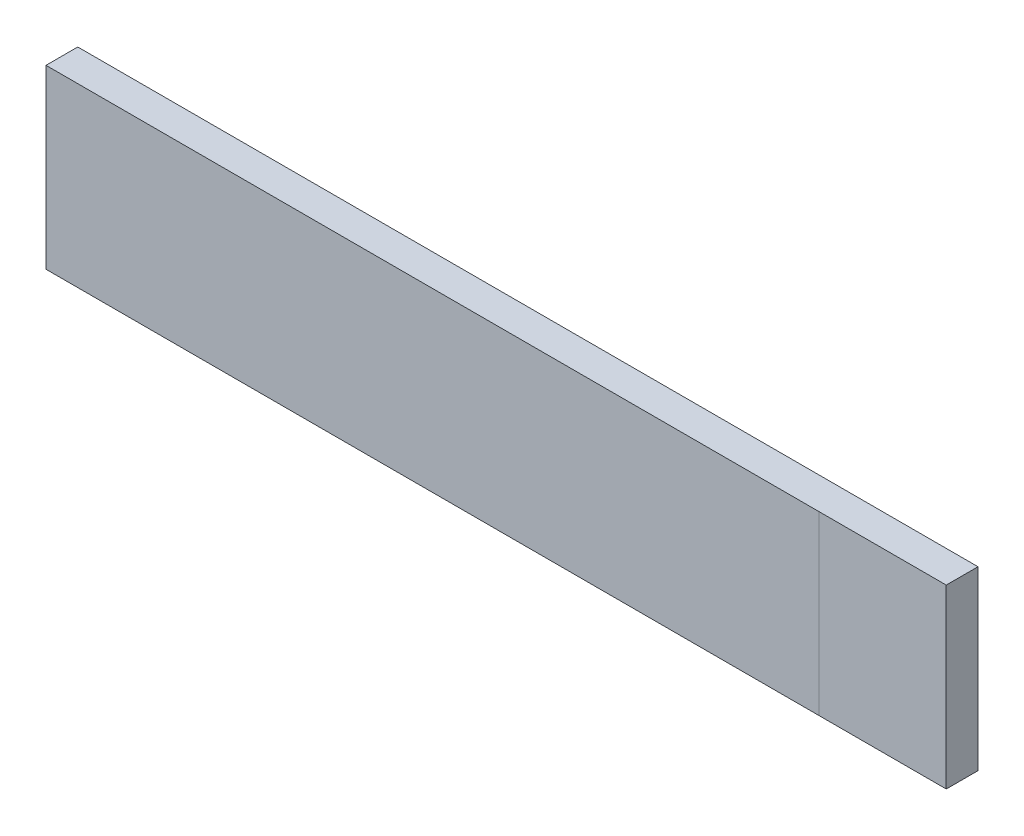
ISO-10303-21;
HEADER;
FILE_DESCRIPTION(('STEP AP214'),'2;1');
FILE_NAME('part.step','',(''),(''),'','','');
FILE_SCHEMA(('AUTOMOTIVE_DESIGN { 1 0 10303 214 1 1 1 1 }'));
ENDSEC;
DATA;
#1=APPLICATION_CONTEXT('core data for automotive mechanical design processes');
#2=APPLICATION_PROTOCOL_DEFINITION('international standard','automotive_design',2000,#1);
#3=PRODUCT_CONTEXT('',#1,'mechanical');
#4=PRODUCT('Part','Part','',(#3));
#5=PRODUCT_RELATED_PRODUCT_CATEGORY('part','',(#4));
#6=PRODUCT_DEFINITION_FORMATION('','',#4);
#7=PRODUCT_DEFINITION_CONTEXT('part definition',#1,'design');
#8=PRODUCT_DEFINITION('design','',#6,#7);
#9=PRODUCT_DEFINITION_SHAPE('','',#8);
#10=(LENGTH_UNIT() NAMED_UNIT(*) SI_UNIT(.MILLI.,.METRE.));
#11=(NAMED_UNIT(*) PLANE_ANGLE_UNIT() SI_UNIT($,.RADIAN.));
#12=(NAMED_UNIT(*) SI_UNIT($,.STERADIAN.) SOLID_ANGLE_UNIT());
#13=UNCERTAINTY_MEASURE_WITH_UNIT(LENGTH_MEASURE(1.E-05),#10,'distance_accuracy_value','');
#14=(GEOMETRIC_REPRESENTATION_CONTEXT(3) GLOBAL_UNCERTAINTY_ASSIGNED_CONTEXT((#13)) GLOBAL_UNIT_ASSIGNED_CONTEXT((#10,
#11,#12)) REPRESENTATION_CONTEXT('',''));
#15=CARTESIAN_POINT('',(0.,0.,0.));
#16=DIRECTION('',(0.,0.,1.));
#17=DIRECTION('',(1.,0.,0.));
#18=AXIS2_PLACEMENT_3D('',#15,#16,#17);
#19=CARTESIAN_POINT('',(0.,0.,10.));
#20=DIRECTION('',(0.,0.,-1.));
#21=DIRECTION('',(-1.,0.,0.));
#22=AXIS2_PLACEMENT_3D('',#19,#20,#21);
#23=PLANE('',#22);
#24=DIRECTION('',(0.,-1.,0.));
#25=VECTOR('',#24,1.);
#26=CARTESIAN_POINT('',(101.733337043281,0.,10.));
#27=LINE('',#26,#25);
#28=CARTESIAN_POINT('',(101.733337043281,27.8112231996147,10.));
#29=VERTEX_POINT('',#28);
#30=CARTESIAN_POINT('',(101.733337043281,-27.8112231996147,10.));
#31=VERTEX_POINT('',#30);
#32=EDGE_CURVE('E11',#29,#31,#27,.T.);
#33=ORIENTED_EDGE('',*,*,#32,.F.);
#34=DIRECTION('',(-1.,0.,0.));
#35=VECTOR('',#34,1.);
#36=CARTESIAN_POINT('',(-141.733337043281,27.8112231996147,10.));
#37=LINE('',#36,#35);
#38=CARTESIAN_POINT('',(-141.733337043281,27.8112231996147,10.));
#39=VERTEX_POINT('',#38);
#40=EDGE_CURVE('E98',#29,#39,#37,.T.);
#41=ORIENTED_EDGE('',*,*,#40,.T.);
#42=DIRECTION('',(0.,-1.,0.));
#43=VECTOR('',#42,1.);
#44=CARTESIAN_POINT('',(-141.733337043281,-27.8112231996147,10.));
#45=LINE('',#44,#43);
#46=CARTESIAN_POINT('',(-141.733337043281,-27.8112231996147,10.));
#47=VERTEX_POINT('',#46);
#48=EDGE_CURVE('E97',#39,#47,#45,.T.);
#49=ORIENTED_EDGE('',*,*,#48,.T.);
#50=DIRECTION('',(1.,0.,0.));
#51=VECTOR('',#50,1.);
#52=CARTESIAN_POINT('',(-141.733337043281,-27.8112231996147,10.));
#53=LINE('',#52,#51);
#54=EDGE_CURVE('E87',#47,#31,#53,.T.);
#55=ORIENTED_EDGE('',*,*,#54,.T.);
#56=EDGE_LOOP('',(#33,#41,#49,#55));
#57=FACE_BOUND('',#56,.T.);
#58=ADVANCED_FACE('F43',(#57),#23,.F.);
#59=CARTESIAN_POINT('',(-141.733337043281,-27.8112231996147,10.));
#60=DIRECTION('',(1.,0.,0.));
#61=DIRECTION('',(0.,0.,-1.));
#62=AXIS2_PLACEMENT_3D('',#59,#60,#61);
#63=PLANE('',#62);
#64=DIRECTION('',(0.,-1.,0.));
#65=VECTOR('',#64,1.);
#66=CARTESIAN_POINT('',(-141.733337043281,-27.8112231996147,0.));
#67=LINE('',#66,#65);
#68=CARTESIAN_POINT('',(-141.733337043281,27.8112231996147,0.));
#69=VERTEX_POINT('',#68);
#70=CARTESIAN_POINT('',(-141.733337043281,-27.8112231996147,0.));
#71=VERTEX_POINT('',#70);
#72=EDGE_CURVE('E105',#69,#71,#67,.T.);
#73=ORIENTED_EDGE('',*,*,#72,.T.);
#74=DIRECTION('',(0.,0.,-1.));
#75=VECTOR('',#74,1.);
#76=CARTESIAN_POINT('',(-141.733337043281,-27.8112231996147,10.));
#77=LINE('',#76,#75);
#78=EDGE_CURVE('E52',#47,#71,#77,.T.);
#79=ORIENTED_EDGE('',*,*,#78,.F.);
#80=ORIENTED_EDGE('',*,*,#48,.F.);
#81=DIRECTION('',(0.,0.,-1.));
#82=VECTOR('',#81,1.);
#83=CARTESIAN_POINT('',(-141.733337043281,27.8112231996147,10.));
#84=LINE('',#83,#82);
#85=EDGE_CURVE('E113',#39,#69,#84,.T.);
#86=ORIENTED_EDGE('',*,*,#85,.T.);
#87=EDGE_LOOP('',(#73,#79,#80,#86));
#88=FACE_BOUND('',#87,.T.);
#89=ADVANCED_FACE('F45',(#88),#63,.F.);
#90=CARTESIAN_POINT('',(-141.733337043281,-27.8112231996147,10.));
#91=DIRECTION('',(0.,1.,0.));
#92=DIRECTION('',(0.,0.,1.));
#93=AXIS2_PLACEMENT_3D('',#90,#91,#92);
#94=PLANE('',#93);
#95=DIRECTION('',(1.,0.,0.));
#96=VECTOR('',#95,1.);
#97=CARTESIAN_POINT('',(-141.733337043281,-27.8112231996147,0.));
#98=LINE('',#97,#96);
#99=CARTESIAN_POINT('',(141.733337043281,-27.8112231996147,0.));
#100=VERTEX_POINT('',#99);
#101=EDGE_CURVE('E119',#71,#100,#98,.T.);
#102=ORIENTED_EDGE('',*,*,#101,.T.);
#103=DIRECTION('',(0.,0.,-1.));
#104=VECTOR('',#103,1.);
#105=CARTESIAN_POINT('',(141.733337043281,-27.8112231996147,10.));
#106=LINE('',#105,#104);
#107=CARTESIAN_POINT('',(141.733337043281,-27.8112231996147,10.));
#108=VERTEX_POINT('',#107);
#109=EDGE_CURVE('E106',#108,#100,#106,.T.);
#110=ORIENTED_EDGE('',*,*,#109,.F.);
#111=EDGE_CURVE('E93',#31,#108,#53,.T.);
#112=ORIENTED_EDGE('',*,*,#111,.F.);
#113=ORIENTED_EDGE('',*,*,#54,.F.);
#114=ORIENTED_EDGE('',*,*,#78,.T.);
#115=EDGE_LOOP('',(#102,#110,#112,#113,#114));
#116=FACE_BOUND('',#115,.T.);
#117=ADVANCED_FACE('F89',(#116),#94,.F.);
#118=CARTESIAN_POINT('',(141.733337043281,-27.8112231996147,10.));
#119=DIRECTION('',(-1.,0.,0.));
#120=DIRECTION('',(0.,0.,1.));
#121=AXIS2_PLACEMENT_3D('',#118,#119,#120);
#122=PLANE('',#121);
#123=DIRECTION('',(0.,1.,0.));
#124=VECTOR('',#123,1.);
#125=CARTESIAN_POINT('',(141.733337043281,-27.8112231996147,0.));
#126=LINE('',#125,#124);
#127=CARTESIAN_POINT('',(141.733337043281,27.8112231996147,0.));
#128=VERTEX_POINT('',#127);
#129=EDGE_CURVE('E117',#100,#128,#126,.T.);
#130=ORIENTED_EDGE('',*,*,#129,.T.);
#131=DIRECTION('',(0.,0.,-1.));
#132=VECTOR('',#131,1.);
#133=CARTESIAN_POINT('',(141.733337043281,27.8112231996147,10.));
#134=LINE('',#133,#132);
#135=CARTESIAN_POINT('',(141.733337043281,27.8112231996147,10.));
#136=VERTEX_POINT('',#135);
#137=EDGE_CURVE('E108',#136,#128,#134,.T.);
#138=ORIENTED_EDGE('',*,*,#137,.F.);
#139=DIRECTION('',(0.,1.,0.));
#140=VECTOR('',#139,1.);
#141=CARTESIAN_POINT('',(141.733337043281,-27.8112231996147,10.));
#142=LINE('',#141,#140);
#143=EDGE_CURVE('E94',#108,#136,#142,.T.);
#144=ORIENTED_EDGE('',*,*,#143,.F.);
#145=ORIENTED_EDGE('',*,*,#109,.T.);
#146=EDGE_LOOP('',(#130,#138,#144,#145));
#147=FACE_BOUND('',#146,.T.);
#148=ADVANCED_FACE('F128',(#147),#122,.F.);
#149=CARTESIAN_POINT('',(-141.733337043281,27.8112231996147,10.));
#150=DIRECTION('',(0.,-1.,0.));
#151=DIRECTION('',(0.,0.,-1.));
#152=AXIS2_PLACEMENT_3D('',#149,#150,#151);
#153=PLANE('',#152);
#154=DIRECTION('',(-1.,0.,0.));
#155=VECTOR('',#154,1.);
#156=CARTESIAN_POINT('',(-141.733337043281,27.8112231996147,0.));
#157=LINE('',#156,#155);
#158=EDGE_CURVE('E102',#128,#69,#157,.T.);
#159=ORIENTED_EDGE('',*,*,#158,.T.);
#160=ORIENTED_EDGE('',*,*,#85,.F.);
#161=ORIENTED_EDGE('',*,*,#40,.F.);
#162=EDGE_CURVE('E115',#136,#29,#37,.T.);
#163=ORIENTED_EDGE('',*,*,#162,.F.);
#164=ORIENTED_EDGE('',*,*,#137,.T.);
#165=EDGE_LOOP('',(#159,#160,#161,#163,#164));
#166=FACE_BOUND('',#165,.T.);
#167=ADVANCED_FACE('F132',(#166),#153,.F.);
#168=ORIENTED_EDGE('',*,*,#162,.T.);
#169=ORIENTED_EDGE('',*,*,#32,.T.);
#170=ORIENTED_EDGE('',*,*,#111,.T.);
#171=ORIENTED_EDGE('',*,*,#143,.T.);
#172=EDGE_LOOP('',(#168,#169,#170,#171));
#173=FACE_BOUND('',#172,.T.);
#174=ADVANCED_FACE('F125',(#173),#23,.F.);
#175=CARTESIAN_POINT('',(0.,0.,0.));
#176=DIRECTION('',(0.,0.,-1.));
#177=DIRECTION('',(-1.,0.,0.));
#178=AXIS2_PLACEMENT_3D('',#175,#176,#177);
#179=PLANE('',#178);
#180=ORIENTED_EDGE('',*,*,#72,.F.);
#181=ORIENTED_EDGE('',*,*,#158,.F.);
#182=ORIENTED_EDGE('',*,*,#129,.F.);
#183=ORIENTED_EDGE('',*,*,#101,.F.);
#184=EDGE_LOOP('',(#180,#181,#182,#183));
#185=FACE_BOUND('',#184,.T.);
#186=ADVANCED_FACE('F134',(#185),#179,.T.);
#187=CLOSED_SHELL('',(#58,#89,#117,#148,#167,#174,#186));
#188=MANIFOLD_SOLID_BREP('B2',#187);
#189=ADVANCED_BREP_SHAPE_REPRESENTATION('',(#18,#188),#14);
#190=SHAPE_DEFINITION_REPRESENTATION(#9,#189);
ENDSEC;
END-ISO-10303-21;
